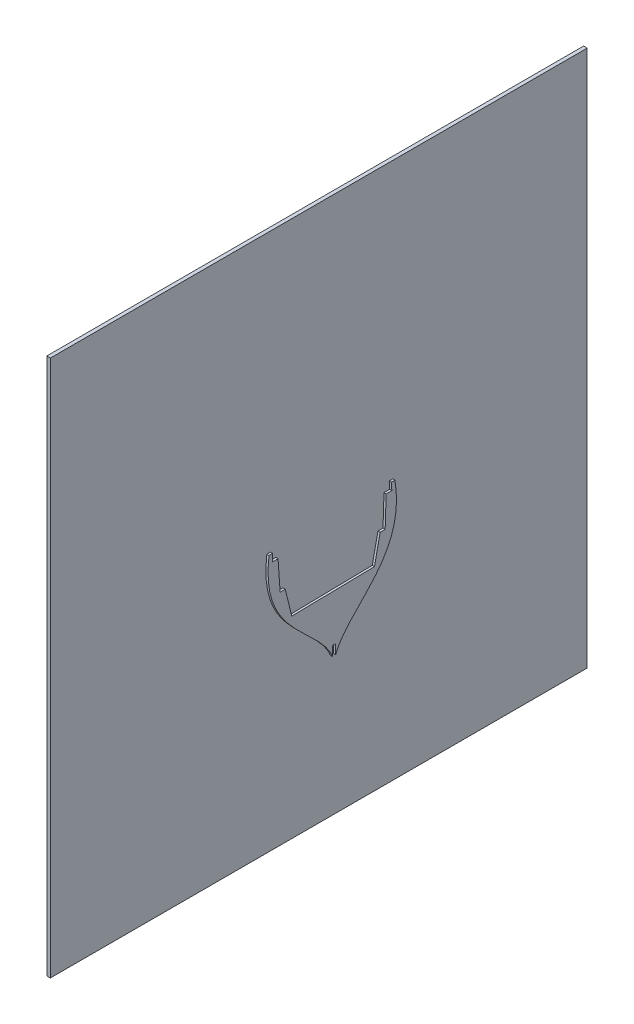
ISO-10303-21;
HEADER;
FILE_DESCRIPTION(('STEP AP214'),'2;1');
FILE_NAME('part.step','',(''),(''),'','','');
FILE_SCHEMA(('AUTOMOTIVE_DESIGN { 1 0 10303 214 1 1 1 1 }'));
ENDSEC;
DATA;
#1=APPLICATION_CONTEXT('core data for automotive mechanical design processes');
#2=APPLICATION_PROTOCOL_DEFINITION('international standard','automotive_design',2000,#1);
#3=PRODUCT_CONTEXT('',#1,'mechanical');
#4=PRODUCT('Part','Part','',(#3));
#5=PRODUCT_RELATED_PRODUCT_CATEGORY('part','',(#4));
#6=PRODUCT_DEFINITION_FORMATION('','',#4);
#7=PRODUCT_DEFINITION_CONTEXT('part definition',#1,'design');
#8=PRODUCT_DEFINITION('design','',#6,#7);
#9=PRODUCT_DEFINITION_SHAPE('','',#8);
#10=(LENGTH_UNIT() NAMED_UNIT(*) SI_UNIT(.MILLI.,.METRE.));
#11=(NAMED_UNIT(*) PLANE_ANGLE_UNIT() SI_UNIT($,.RADIAN.));
#12=(NAMED_UNIT(*) SI_UNIT($,.STERADIAN.) SOLID_ANGLE_UNIT());
#13=UNCERTAINTY_MEASURE_WITH_UNIT(LENGTH_MEASURE(1.E-05),#10,'distance_accuracy_value','');
#14=(GEOMETRIC_REPRESENTATION_CONTEXT(3) GLOBAL_UNCERTAINTY_ASSIGNED_CONTEXT((#13)) GLOBAL_UNIT_ASSIGNED_CONTEXT((#10,
#11,#12)) REPRESENTATION_CONTEXT('',''));
#15=CARTESIAN_POINT('',(0.,0.,0.));
#16=DIRECTION('',(0.,0.,1.));
#17=DIRECTION('',(1.,0.,0.));
#18=AXIS2_PLACEMENT_3D('',#15,#16,#17);
#19=CARTESIAN_POINT('',(6.,354.14290279738,182.445244332377));
#20=CARTESIAN_POINT('',(6.,127.075372846302,211.353019638818));
#21=CARTESIAN_POINT('',(6.,119.589146316814,16.394807678994));
#22=CARTESIAN_POINT('',(6.,15.6805323322991,0.284058758771133));
#23=CARTESIAN_POINT('',(6.,0.,0.));
#24=B_SPLINE_CURVE_WITH_KNOTS('',4,(#19,#20,#21,#22,#23),.UNSPECIFIED.,.F.,.F.,(5,5),(0.,1.),.UNSPECIFIED.);
#25=DIRECTION('',(-1.,0.,0.));
#26=VECTOR('',#25,1.);
#27=SURFACE_OF_LINEAR_EXTRUSION('',#24,#26);
#28=CARTESIAN_POINT('',(0.,354.14290279738,182.445244332377));
#29=CARTESIAN_POINT('',(0.,127.075372846302,211.353019638818));
#30=CARTESIAN_POINT('',(0.,119.589146316814,16.394807678994));
#31=CARTESIAN_POINT('',(0.,15.6805323322991,0.284058758771133));
#32=CARTESIAN_POINT('',(0.,0.,0.));
#33=B_SPLINE_CURVE_WITH_KNOTS('',4,(#28,#29,#30,#31,#32),.UNSPECIFIED.,.F.,.F.,(5,5),(0.,1.),.UNSPECIFIED.);
#34=CARTESIAN_POINT('',(0.,354.14290279738,182.445244332377));
#35=VERTEX_POINT('',#34);
#36=CARTESIAN_POINT('',(0.,20.8021304929707,4.87831519262331));
#37=VERTEX_POINT('',#36);
#38=EDGE_CURVE('E191',#35,#37,#33,.T.);
#39=ORIENTED_EDGE('',*,*,#38,.T.);
#40=DIRECTION('',(1.,0.,0.));
#41=VECTOR('',#40,1.);
#42=CARTESIAN_POINT('',(0.,20.8021304929707,4.87831519262331));
#43=LINE('',#42,#41);
#44=CARTESIAN_POINT('',(6.,20.8021304929707,4.87831519262331));
#45=VERTEX_POINT('',#44);
#46=EDGE_CURVE('E197',#37,#45,#43,.T.);
#47=ORIENTED_EDGE('',*,*,#46,.T.);
#48=CARTESIAN_POINT('',(6.,354.14290279738,182.445244332377));
#49=VERTEX_POINT('',#48);
#50=EDGE_CURVE('E231',#49,#45,#24,.T.);
#51=ORIENTED_EDGE('',*,*,#50,.F.);
#52=DIRECTION('',(-1.,0.,0.));
#53=VECTOR('',#52,1.);
#54=CARTESIAN_POINT('',(6.,354.14290279738,182.445244332377));
#55=LINE('',#54,#53);
#56=EDGE_CURVE('E187',#49,#35,#55,.T.);
#57=ORIENTED_EDGE('',*,*,#56,.T.);
#58=EDGE_LOOP('',(#39,#47,#51,#57));
#59=FACE_BOUND('',#58,.T.);
#60=ADVANCED_FACE('F45',(#59),#27,.F.);
#61=CARTESIAN_POINT('',(6.,0.,0.));
#62=CARTESIAN_POINT('',(6.,15.6805323322991,0.284058758771133));
#63=CARTESIAN_POINT('',(6.,120.104483055444,-12.0526671571066));
#64=CARTESIAN_POINT('',(6.,134.646963610102,-206.611820777644));
#65=CARTESIAN_POINT('',(6.,360.518503443272,-169.498883348176));
#66=B_SPLINE_CURVE_WITH_KNOTS('',4,(#61,#62,#63,#64,#65),.UNSPECIFIED.,.F.,.F.,(5,5),(0.,1.),.UNSPECIFIED.);
#67=DIRECTION('',(-1.,0.,0.));
#68=VECTOR('',#67,1.);
#69=SURFACE_OF_LINEAR_EXTRUSION('',#66,#68);
#70=CARTESIAN_POINT('',(6.,20.9651688882728,-4.12168480737669));
#71=VERTEX_POINT('',#70);
#72=CARTESIAN_POINT('',(6.,360.518503443272,-169.498883348176));
#73=VERTEX_POINT('',#72);
#74=EDGE_CURVE('E128',#71,#73,#66,.T.);
#75=ORIENTED_EDGE('',*,*,#74,.F.);
#76=DIRECTION('',(1.,0.,0.));
#77=VECTOR('',#76,1.);
#78=CARTESIAN_POINT('',(0.,20.9651688882728,-4.12168480737669));
#79=LINE('',#78,#77);
#80=CARTESIAN_POINT('',(0.,20.9651688882728,-4.12168480737669));
#81=VERTEX_POINT('',#80);
#82=EDGE_CURVE('E323',#81,#71,#79,.T.);
#83=ORIENTED_EDGE('',*,*,#82,.F.);
#84=CARTESIAN_POINT('',(0.,0.,0.));
#85=CARTESIAN_POINT('',(0.,15.6805323322991,0.284058758771133));
#86=CARTESIAN_POINT('',(0.,120.104483055444,-12.0526671571066));
#87=CARTESIAN_POINT('',(0.,134.646963610102,-206.611820777644));
#88=CARTESIAN_POINT('',(0.,360.518503443272,-169.498883348176));
#89=B_SPLINE_CURVE_WITH_KNOTS('',4,(#84,#85,#86,#87,#88),.UNSPECIFIED.,.F.,.F.,(5,5),(0.,1.),.UNSPECIFIED.);
#90=CARTESIAN_POINT('',(0.,360.518503443272,-169.498883348176));
#91=VERTEX_POINT('',#90);
#92=EDGE_CURVE('E196',#81,#91,#89,.T.);
#93=ORIENTED_EDGE('',*,*,#92,.T.);
#94=DIRECTION('',(-1.,0.,0.));
#95=VECTOR('',#94,1.);
#96=CARTESIAN_POINT('',(6.,360.518503443272,-169.498883348176));
#97=LINE('',#96,#95);
#98=EDGE_CURVE('E13',#73,#91,#97,.T.);
#99=ORIENTED_EDGE('',*,*,#98,.F.);
#100=EDGE_LOOP('',(#75,#83,#93,#99));
#101=FACE_BOUND('',#100,.T.);
#102=ADVANCED_FACE('F335',(#101),#69,.F.);
#103=CARTESIAN_POINT('',(6.,360.518503443272,-169.498883348176));
#104=DIRECTION('',(0.,-0.999835956927465,-0.0181124055536444));
#105=DIRECTION('',(0.,0.0181124055536444,-0.999835956927465));
#106=AXIS2_PLACEMENT_3D('',#103,#104,#105);
#107=PLANE('',#106);
#108=DIRECTION('',(0.,-0.0181124055536444,0.999835956927465));
#109=VECTOR('',#108,1.);
#110=CARTESIAN_POINT('',(0.,360.518503443272,-169.498883348176));
#111=LINE('',#110,#109);
#112=CARTESIAN_POINT('',(0.,360.337349670715,-159.498883348176));
#113=VERTEX_POINT('',#112);
#114=EDGE_CURVE('E204',#91,#113,#111,.T.);
#115=ORIENTED_EDGE('',*,*,#114,.T.);
#116=DIRECTION('',(-1.,0.,0.));
#117=VECTOR('',#116,1.);
#118=CARTESIAN_POINT('',(6.,360.337349670715,-159.498883348176));
#119=LINE('',#118,#117);
#120=CARTESIAN_POINT('',(6.,360.337349670715,-159.498883348176));
#121=VERTEX_POINT('',#120);
#122=EDGE_CURVE('E53',#121,#113,#119,.T.);
#123=ORIENTED_EDGE('',*,*,#122,.F.);
#124=DIRECTION('',(0.,-0.0181124055536444,0.999835956927465));
#125=VECTOR('',#124,1.);
#126=CARTESIAN_POINT('',(6.,360.518503443272,-169.498883348176));
#127=LINE('',#126,#125);
#128=EDGE_CURVE('E317',#73,#121,#127,.T.);
#129=ORIENTED_EDGE('',*,*,#128,.F.);
#130=ORIENTED_EDGE('',*,*,#98,.T.);
#131=EDGE_LOOP('',(#115,#123,#129,#130));
#132=FACE_BOUND('',#131,.T.);
#133=ADVANCED_FACE('F338',(#132),#107,.F.);
#134=CARTESIAN_POINT('',(6.,360.337349670715,-159.498883348176));
#135=DIRECTION('',(0.,0.0615422827320697,-0.998104477214748));
#136=DIRECTION('',(0.,0.998104477214748,0.0615422827320697));
#137=AXIS2_PLACEMENT_3D('',#134,#135,#136);
#138=PLANE('',#137);
#139=DIRECTION('',(0.,-0.998104477214748,-0.0615422827320697));
#140=VECTOR('',#139,1.);
#141=CARTESIAN_POINT('',(0.,360.337349670715,-159.498883348176));
#142=LINE('',#141,#140);
#143=CARTESIAN_POINT('',(0.,339.756849084553,-160.76785970762));
#144=VERTEX_POINT('',#143);
#145=EDGE_CURVE('E209',#113,#144,#142,.T.);
#146=ORIENTED_EDGE('',*,*,#145,.T.);
#147=DIRECTION('',(-1.,0.,0.));
#148=VECTOR('',#147,1.);
#149=CARTESIAN_POINT('',(6.,339.756849084553,-160.76785970762));
#150=LINE('',#149,#148);
#151=CARTESIAN_POINT('',(6.,339.756849084553,-160.76785970762));
#152=VERTEX_POINT('',#151);
#153=EDGE_CURVE('E256',#152,#144,#150,.T.);
#154=ORIENTED_EDGE('',*,*,#153,.F.);
#155=DIRECTION('',(0.,-0.998104477214748,-0.0615422827320697));
#156=VECTOR('',#155,1.);
#157=CARTESIAN_POINT('',(6.,360.337349670715,-159.498883348176));
#158=LINE('',#157,#156);
#159=EDGE_CURVE('E265',#121,#152,#158,.T.);
#160=ORIENTED_EDGE('',*,*,#159,.F.);
#161=ORIENTED_EDGE('',*,*,#122,.T.);
#162=EDGE_LOOP('',(#146,#154,#160,#161));
#163=FACE_BOUND('',#162,.T.);
#164=ADVANCED_FACE('F263',(#163),#138,.F.);
#165=CARTESIAN_POINT('',(6.,339.756849084553,-160.76785970762));
#166=DIRECTION('',(0.,-0.999835956927465,-0.0181124055536401));
#167=DIRECTION('',(0.,0.0181124055536401,-0.999835956927466));
#168=AXIS2_PLACEMENT_3D('',#165,#166,#167);
#169=PLANE('',#168);
#170=DIRECTION('',(0.,-0.0181124055536401,0.999835956927465));
#171=VECTOR('',#170,1.);
#172=CARTESIAN_POINT('',(0.,339.756849084553,-160.76785970762));
#173=LINE('',#172,#171);
#174=CARTESIAN_POINT('',(0.,339.469822373553,-144.923491304635));
#175=VERTEX_POINT('',#174);
#176=EDGE_CURVE('E211',#144,#175,#173,.T.);
#177=ORIENTED_EDGE('',*,*,#176,.T.);
#178=DIRECTION('',(-1.,0.,0.));
#179=VECTOR('',#178,1.);
#180=CARTESIAN_POINT('',(6.,339.469822373553,-144.923491304635));
#181=LINE('',#180,#179);
#182=CARTESIAN_POINT('',(6.,339.469822373553,-144.923491304635));
#183=VERTEX_POINT('',#182);
#184=EDGE_CURVE('E253',#183,#175,#181,.T.);
#185=ORIENTED_EDGE('',*,*,#184,.F.);
#186=DIRECTION('',(0.,-0.0181124055536401,0.999835956927465));
#187=VECTOR('',#186,1.);
#188=CARTESIAN_POINT('',(6.,339.756849084553,-160.76785970762));
#189=LINE('',#188,#187);
#190=EDGE_CURVE('E287',#152,#183,#189,.T.);
#191=ORIENTED_EDGE('',*,*,#190,.F.);
#192=ORIENTED_EDGE('',*,*,#153,.T.);
#193=EDGE_LOOP('',(#177,#185,#191,#192));
#194=FACE_BOUND('',#193,.T.);
#195=ADVANCED_FACE('F278',(#194),#169,.F.);
#196=CARTESIAN_POINT('',(6.,339.469822373553,-144.923491304635));
#197=DIRECTION('',(0.,-0.0328630670926228,-0.999459863536934));
#198=DIRECTION('',(0.,0.999459863536934,-0.0328630670926228));
#199=AXIS2_PLACEMENT_3D('',#196,#197,#198);
#200=PLANE('',#199);
#201=DIRECTION('',(0.,-0.999459863536934,0.0328630670926228));
#202=VECTOR('',#201,1.);
#203=CARTESIAN_POINT('',(0.,339.469822373553,-144.923491304635));
#204=LINE('',#203,#202);
#205=CARTESIAN_POINT('',(0.,255.19639745031,-142.152511379961));
#206=VERTEX_POINT('',#205);
#207=EDGE_CURVE('E213',#175,#206,#204,.T.);
#208=ORIENTED_EDGE('',*,*,#207,.T.);
#209=DIRECTION('',(-1.,0.,0.));
#210=VECTOR('',#209,1.);
#211=CARTESIAN_POINT('',(6.,255.19639745031,-142.152511379961));
#212=LINE('',#211,#210);
#213=CARTESIAN_POINT('',(6.,255.19639745031,-142.152511379961));
#214=VERTEX_POINT('',#213);
#215=EDGE_CURVE('E250',#214,#206,#212,.T.);
#216=ORIENTED_EDGE('',*,*,#215,.F.);
#217=DIRECTION('',(0.,-0.999459863536934,0.0328630670926228));
#218=VECTOR('',#217,1.);
#219=CARTESIAN_POINT('',(6.,339.469822373553,-144.923491304635));
#220=LINE('',#219,#218);
#221=EDGE_CURVE('E284',#183,#214,#220,.T.);
#222=ORIENTED_EDGE('',*,*,#221,.F.);
#223=ORIENTED_EDGE('',*,*,#184,.T.);
#224=EDGE_LOOP('',(#208,#216,#222,#223));
#225=FACE_BOUND('',#224,.T.);
#226=ADVANCED_FACE('F282',(#225),#200,.F.);
#227=CARTESIAN_POINT('',(6.,255.19639745031,-142.152511379961));
#228=DIRECTION('',(0.,-0.999835956927465,-0.0181124055536419));
#229=DIRECTION('',(0.,0.0181124055536419,-0.999835956927466));
#230=AXIS2_PLACEMENT_3D('',#227,#228,#229);
#231=PLANE('',#230);
#232=DIRECTION('',(0.,-0.0181124055536419,0.999835956927466));
#233=VECTOR('',#232,1.);
#234=CARTESIAN_POINT('',(0.,255.19639745031,-142.152511379961));
#235=LINE('',#234,#233);
#236=CARTESIAN_POINT('',(0.,254.939924048743,-127.994738238122));
#237=VERTEX_POINT('',#236);
#238=EDGE_CURVE('E215',#206,#237,#235,.T.);
#239=ORIENTED_EDGE('',*,*,#238,.T.);
#240=DIRECTION('',(-1.,0.,0.));
#241=VECTOR('',#240,1.);
#242=CARTESIAN_POINT('',(6.,254.939924048743,-127.994738238122));
#243=LINE('',#242,#241);
#244=CARTESIAN_POINT('',(6.,254.939924048743,-127.994738238122));
#245=VERTEX_POINT('',#244);
#246=EDGE_CURVE('E247',#245,#237,#243,.T.);
#247=ORIENTED_EDGE('',*,*,#246,.F.);
#248=DIRECTION('',(0.,-0.0181124055536419,0.999835956927466));
#249=VECTOR('',#248,1.);
#250=CARTESIAN_POINT('',(6.,255.19639745031,-142.152511379961));
#251=LINE('',#250,#249);
#252=EDGE_CURVE('E286',#214,#245,#251,.T.);
#253=ORIENTED_EDGE('',*,*,#252,.F.);
#254=ORIENTED_EDGE('',*,*,#215,.T.);
#255=EDGE_LOOP('',(#239,#247,#253,#254));
#256=FACE_BOUND('',#255,.T.);
#257=ADVANCED_FACE('F348',(#256),#231,.F.);
#258=CARTESIAN_POINT('',(6.,254.939924048743,-127.994738238122));
#259=DIRECTION('',(0.,-0.204713614072454,-0.978821912409706));
#260=DIRECTION('',(0.,0.978821912409706,-0.204713614072454));
#261=AXIS2_PLACEMENT_3D('',#258,#259,#260);
#262=PLANE('',#261);
#263=DIRECTION('',(0.,-0.978821912409706,0.204713614072454));
#264=VECTOR('',#263,1.);
#265=CARTESIAN_POINT('',(0.,254.939924048743,-127.994738238122));
#266=LINE('',#265,#264);
#267=CARTESIAN_POINT('',(0.,179.89257139475,-112.299120277806));
#268=VERTEX_POINT('',#267);
#269=EDGE_CURVE('E217',#237,#268,#266,.T.);
#270=ORIENTED_EDGE('',*,*,#269,.T.);
#271=DIRECTION('',(-1.,0.,0.));
#272=VECTOR('',#271,1.);
#273=CARTESIAN_POINT('',(6.,179.89257139475,-112.299120277806));
#274=LINE('',#273,#272);
#275=CARTESIAN_POINT('',(6.,179.89257139475,-112.299120277806));
#276=VERTEX_POINT('',#275);
#277=EDGE_CURVE('E244',#276,#268,#274,.T.);
#278=ORIENTED_EDGE('',*,*,#277,.F.);
#279=DIRECTION('',(0.,-0.978821912409706,0.204713614072454));
#280=VECTOR('',#279,1.);
#281=CARTESIAN_POINT('',(6.,254.939924048743,-127.994738238122));
#282=LINE('',#281,#280);
#283=EDGE_CURVE('E289',#245,#276,#282,.T.);
#284=ORIENTED_EDGE('',*,*,#283,.F.);
#285=ORIENTED_EDGE('',*,*,#246,.T.);
#286=EDGE_LOOP('',(#270,#278,#284,#285));
#287=FACE_BOUND('',#286,.T.);
#288=ADVANCED_FACE('F351',(#287),#262,.F.);
#289=CARTESIAN_POINT('',(6.,179.89257139475,-112.299120277806));
#290=DIRECTION('',(0.,-0.999835956927465,-0.0181124055536431));
#291=DIRECTION('',(0.,0.0181124055536431,-0.999835956927466));
#292=AXIS2_PLACEMENT_3D('',#289,#290,#291);
#293=PLANE('',#292);
#294=DIRECTION('',(0.,-0.0181124055536431,0.999835956927465));
#295=VECTOR('',#294,1.);
#296=CARTESIAN_POINT('',(0.,179.89257139475,-112.299120277806));
#297=LINE('',#296,#295);
#298=CARTESIAN_POINT('',(0.,175.707193466071,118.740944170329));
#299=VERTEX_POINT('',#298);
#300=EDGE_CURVE('E219',#268,#299,#297,.T.);
#301=ORIENTED_EDGE('',*,*,#300,.T.);
#302=DIRECTION('',(-1.,0.,0.));
#303=VECTOR('',#302,1.);
#304=CARTESIAN_POINT('',(6.,175.707193466071,118.740944170329));
#305=LINE('',#304,#303);
#306=CARTESIAN_POINT('',(6.,175.707193466071,118.740944170329));
#307=VERTEX_POINT('',#306);
#308=EDGE_CURVE('E241',#307,#299,#305,.T.);
#309=ORIENTED_EDGE('',*,*,#308,.F.);
#310=DIRECTION('',(0.,-0.0181124055536431,0.999835956927465));
#311=VECTOR('',#310,1.);
#312=CARTESIAN_POINT('',(6.,179.89257139475,-112.299120277806));
#313=LINE('',#312,#311);
#314=EDGE_CURVE('E295',#276,#307,#313,.T.);
#315=ORIENTED_EDGE('',*,*,#314,.F.);
#316=ORIENTED_EDGE('',*,*,#277,.T.);
#317=EDGE_LOOP('',(#301,#309,#315,#316));
#318=FACE_BOUND('',#317,.T.);
#319=ADVANCED_FACE('F355',(#318),#293,.F.);
#320=CARTESIAN_POINT('',(6.,250.136828640148,137.14439415621));
#321=DIRECTION('',(0.,-0.240031119993913,0.970765193769568));
#322=DIRECTION('',(0.,-0.970765193769568,-0.240031119993913));
#323=AXIS2_PLACEMENT_3D('',#320,#321,#322);
#324=PLANE('',#323);
#325=DIRECTION('',(0.,0.970765193769568,0.240031119993913));
#326=VECTOR('',#325,1.);
#327=CARTESIAN_POINT('',(0.,250.136828640148,137.14439415621));
#328=LINE('',#327,#326);
#329=CARTESIAN_POINT('',(0.,250.136828640148,137.14439415621));
#330=VERTEX_POINT('',#329);
#331=EDGE_CURVE('E221',#299,#330,#328,.T.);
#332=ORIENTED_EDGE('',*,*,#331,.T.);
#333=DIRECTION('',(-1.,0.,0.));
#334=VECTOR('',#333,1.);
#335=CARTESIAN_POINT('',(6.,250.136828640148,137.14439415621));
#336=LINE('',#335,#334);
#337=CARTESIAN_POINT('',(6.,250.136828640148,137.14439415621));
#338=VERTEX_POINT('',#337);
#339=EDGE_CURVE('E238',#338,#330,#336,.T.);
#340=ORIENTED_EDGE('',*,*,#339,.F.);
#341=DIRECTION('',(0.,0.970765193769568,0.240031119993913));
#342=VECTOR('',#341,1.);
#343=CARTESIAN_POINT('',(6.,250.136828640148,137.14439415621));
#344=LINE('',#343,#342);
#345=EDGE_CURVE('E297',#307,#338,#344,.T.);
#346=ORIENTED_EDGE('',*,*,#345,.F.);
#347=ORIENTED_EDGE('',*,*,#308,.T.);
#348=EDGE_LOOP('',(#332,#340,#346,#347));
#349=FACE_BOUND('',#348,.T.);
#350=ADVANCED_FACE('F359',(#349),#324,.F.);
#351=CARTESIAN_POINT('',(6.,249.880355238581,151.302167298049));
#352=DIRECTION('',(0.,-0.999835956927465,-0.0181124055536438));
#353=DIRECTION('',(0.,0.0181124055536438,-0.999835956927466));
#354=AXIS2_PLACEMENT_3D('',#351,#352,#353);
#355=PLANE('',#354);
#356=DIRECTION('',(0.,-0.0181124055536438,0.999835956927465));
#357=VECTOR('',#356,1.);
#358=CARTESIAN_POINT('',(0.,249.880355238581,151.302167298049));
#359=LINE('',#358,#357);
#360=CARTESIAN_POINT('',(0.,249.880355238581,151.302167298049));
#361=VERTEX_POINT('',#360);
#362=EDGE_CURVE('E223',#330,#361,#359,.T.);
#363=ORIENTED_EDGE('',*,*,#362,.T.);
#364=DIRECTION('',(-1.,0.,0.));
#365=VECTOR('',#364,1.);
#366=CARTESIAN_POINT('',(6.,249.880355238581,151.302167298049));
#367=LINE('',#366,#365);
#368=CARTESIAN_POINT('',(6.,249.880355238581,151.302167298049));
#369=VERTEX_POINT('',#368);
#370=EDGE_CURVE('E235',#369,#361,#367,.T.);
#371=ORIENTED_EDGE('',*,*,#370,.F.);
#372=DIRECTION('',(0.,-0.0181124055536438,0.999835956927465));
#373=VECTOR('',#372,1.);
#374=CARTESIAN_POINT('',(6.,249.880355238581,151.302167298049));
#375=LINE('',#374,#373);
#376=EDGE_CURVE('E299',#338,#369,#375,.T.);
#377=ORIENTED_EDGE('',*,*,#376,.F.);
#378=ORIENTED_EDGE('',*,*,#339,.T.);
#379=EDGE_LOOP('',(#363,#371,#377,#378));
#380=FACE_BOUND('',#379,.T.);
#381=ADVANCED_FACE('F305',(#380),#355,.F.);
#382=CARTESIAN_POINT('',(6.,333.998125053212,157.123617241952));
#383=DIRECTION('',(0.,-0.0690408105736718,0.997613836349181));
#384=DIRECTION('',(0.,-0.997613836349181,-0.0690408105736718));
#385=AXIS2_PLACEMENT_3D('',#382,#383,#384);
#386=PLANE('',#385);
#387=DIRECTION('',(0.,0.997613836349181,0.0690408105736718));
#388=VECTOR('',#387,1.);
#389=CARTESIAN_POINT('',(0.,333.998125053212,157.123617241952));
#390=LINE('',#389,#388);
#391=CARTESIAN_POINT('',(0.,333.998125053212,157.123617241952));
#392=VERTEX_POINT('',#391);
#393=EDGE_CURVE('E225',#361,#392,#390,.T.);
#394=ORIENTED_EDGE('',*,*,#393,.T.);
#395=DIRECTION('',(-1.,0.,0.));
#396=VECTOR('',#395,1.);
#397=CARTESIAN_POINT('',(6.,333.998125053212,157.123617241952));
#398=LINE('',#397,#396);
#399=CARTESIAN_POINT('',(6.,333.998125053212,157.123617241952));
#400=VERTEX_POINT('',#399);
#401=EDGE_CURVE('E182',#400,#392,#398,.T.);
#402=ORIENTED_EDGE('',*,*,#401,.F.);
#403=DIRECTION('',(0.,0.997613836349181,0.0690408105736718));
#404=VECTOR('',#403,1.);
#405=CARTESIAN_POINT('',(6.,333.998125053212,157.123617241952));
#406=LINE('',#405,#404);
#407=EDGE_CURVE('E170',#369,#400,#406,.T.);
#408=ORIENTED_EDGE('',*,*,#407,.F.);
#409=ORIENTED_EDGE('',*,*,#370,.T.);
#410=EDGE_LOOP('',(#394,#402,#408,#409));
#411=FACE_BOUND('',#410,.T.);
#412=ADVANCED_FACE('F309',(#411),#386,.F.);
#413=CARTESIAN_POINT('',(6.,333.711098342212,172.967985644937));
#414=DIRECTION('',(0.,-0.999835956927465,-0.0181124055536435));
#415=DIRECTION('',(0.,0.0181124055536435,-0.999835956927465));
#416=AXIS2_PLACEMENT_3D('',#413,#414,#415);
#417=PLANE('',#416);
#418=DIRECTION('',(0.,-0.0181124055536435,0.999835956927466));
#419=VECTOR('',#418,1.);
#420=CARTESIAN_POINT('',(0.,333.711098342212,172.967985644937));
#421=LINE('',#420,#419);
#422=CARTESIAN_POINT('',(0.,333.711098342212,172.967985644937));
#423=VERTEX_POINT('',#422);
#424=EDGE_CURVE('E179',#392,#423,#421,.T.);
#425=ORIENTED_EDGE('',*,*,#424,.T.);
#426=DIRECTION('',(-1.,0.,0.));
#427=VECTOR('',#426,1.);
#428=CARTESIAN_POINT('',(6.,333.711098342212,172.967985644937));
#429=LINE('',#428,#427);
#430=CARTESIAN_POINT('',(6.,333.711098342212,172.967985644937));
#431=VERTEX_POINT('',#430);
#432=EDGE_CURVE('E176',#431,#423,#429,.T.);
#433=ORIENTED_EDGE('',*,*,#432,.F.);
#434=DIRECTION('',(0.,-0.0181124055536435,0.999835956927466));
#435=VECTOR('',#434,1.);
#436=CARTESIAN_POINT('',(6.,333.711098342212,172.967985644937));
#437=LINE('',#436,#435);
#438=EDGE_CURVE('E163',#400,#431,#437,.T.);
#439=ORIENTED_EDGE('',*,*,#438,.F.);
#440=ORIENTED_EDGE('',*,*,#401,.T.);
#441=EDGE_LOOP('',(#425,#433,#439,#440));
#442=FACE_BOUND('',#441,.T.);
#443=ADVANCED_FACE('F177',(#442),#417,.F.);
#444=CARTESIAN_POINT('',(6.,354.324056569938,172.445244332377));
#445=DIRECTION('',(0.,0.0253516887165575,0.999678594288794));
#446=DIRECTION('',(0.,-0.999678594288794,0.0253516887165575));
#447=AXIS2_PLACEMENT_3D('',#444,#445,#446);
#448=PLANE('',#447);
#449=DIRECTION('',(0.,0.999678594288794,-0.0253516887165575));
#450=VECTOR('',#449,1.);
#451=CARTESIAN_POINT('',(0.,354.324056569938,172.445244332377));
#452=LINE('',#451,#450);
#453=CARTESIAN_POINT('',(0.,354.324056569938,172.445244332377));
#454=VERTEX_POINT('',#453);
#455=EDGE_CURVE('E228',#423,#454,#452,.T.);
#456=ORIENTED_EDGE('',*,*,#455,.T.);
#457=DIRECTION('',(-1.,0.,0.));
#458=VECTOR('',#457,1.);
#459=CARTESIAN_POINT('',(6.,354.324056569938,172.445244332377));
#460=LINE('',#459,#458);
#461=CARTESIAN_POINT('',(6.,354.324056569938,172.445244332377));
#462=VERTEX_POINT('',#461);
#463=EDGE_CURVE('E183',#462,#454,#460,.T.);
#464=ORIENTED_EDGE('',*,*,#463,.F.);
#465=DIRECTION('',(0.,0.999678594288794,-0.0253516887165575));
#466=VECTOR('',#465,1.);
#467=CARTESIAN_POINT('',(6.,354.324056569938,172.445244332377));
#468=LINE('',#467,#466);
#469=EDGE_CURVE('E167',#431,#462,#468,.T.);
#470=ORIENTED_EDGE('',*,*,#469,.F.);
#471=ORIENTED_EDGE('',*,*,#432,.T.);
#472=EDGE_LOOP('',(#456,#464,#470,#471));
#473=FACE_BOUND('',#472,.T.);
#474=ADVANCED_FACE('F185',(#473),#448,.F.);
#475=CARTESIAN_POINT('',(6.,354.14290279738,182.445244332377));
#476=DIRECTION('',(0.,-0.999835956927465,-0.0181124055536444));
#477=DIRECTION('',(0.,0.0181124055536444,-0.999835956927465));
#478=AXIS2_PLACEMENT_3D('',#475,#476,#477);
#479=PLANE('',#478);
#480=DIRECTION('',(0.,-0.0181124055536444,0.999835956927465));
#481=VECTOR('',#480,1.);
#482=CARTESIAN_POINT('',(0.,354.14290279738,182.445244332377));
#483=LINE('',#482,#481);
#484=EDGE_CURVE('E120',#454,#35,#483,.T.);
#485=ORIENTED_EDGE('',*,*,#484,.T.);
#486=ORIENTED_EDGE('',*,*,#56,.F.);
#487=DIRECTION('',(0.,-0.0181124055536444,0.999835956927465));
#488=VECTOR('',#487,1.);
#489=CARTESIAN_POINT('',(6.,354.14290279738,182.445244332377));
#490=LINE('',#489,#488);
#491=EDGE_CURVE('E69',#462,#49,#490,.T.);
#492=ORIENTED_EDGE('',*,*,#491,.F.);
#493=ORIENTED_EDGE('',*,*,#463,.T.);
#494=EDGE_LOOP('',(#485,#486,#492,#493));
#495=FACE_BOUND('',#494,.T.);
#496=ADVANCED_FACE('F311',(#495),#479,.F.);
#497=CARTESIAN_POINT('',(6.,102.668837588292,70.4601502497936));
#498=DIRECTION('',(-1.,0.,0.));
#499=DIRECTION('',(0.,0.,1.));
#500=AXIS2_PLACEMENT_3D('',#497,#498,#499);
#501=PLANE('',#500);
#502=ORIENTED_EDGE('',*,*,#50,.T.);
#503=DIRECTION('',(0.,-0.999835956927465,-0.0181124055536429));
#504=VECTOR('',#503,1.);
#505=CARTESIAN_POINT('',(6.,20.8021304929707,4.87831519262331));
#506=LINE('',#505,#504);
#507=CARTESIAN_POINT('',(6.,47.8021304929707,5.36743037852959));
#508=VERTEX_POINT('',#507);
#509=EDGE_CURVE('E511',#508,#45,#506,.T.);
#510=ORIENTED_EDGE('',*,*,#509,.F.);
#511=DIRECTION('',(0.,-0.0181124055536438,0.999835956927465));
#512=VECTOR('',#511,1.);
#513=CARTESIAN_POINT('',(6.,47.8021304929707,5.36743037852959));
#514=LINE('',#513,#512);
#515=CARTESIAN_POINT('',(6.,47.9651688882728,-3.63256962147041));
#516=VERTEX_POINT('',#515);
#517=EDGE_CURVE('E519',#516,#508,#514,.T.);
#518=ORIENTED_EDGE('',*,*,#517,.F.);
#519=DIRECTION('',(0.,0.999835956927465,0.0181124055536428));
#520=VECTOR('',#519,1.);
#521=CARTESIAN_POINT('',(6.,47.9651688882728,-3.63256962147041));
#522=LINE('',#521,#520);
#523=EDGE_CURVE('E523',#71,#516,#522,.T.);
#524=ORIENTED_EDGE('',*,*,#523,.F.);
#525=ORIENTED_EDGE('',*,*,#74,.T.);
#526=ORIENTED_EDGE('',*,*,#128,.T.);
#527=ORIENTED_EDGE('',*,*,#159,.T.);
#528=ORIENTED_EDGE('',*,*,#190,.T.);
#529=ORIENTED_EDGE('',*,*,#221,.T.);
#530=ORIENTED_EDGE('',*,*,#252,.T.);
#531=ORIENTED_EDGE('',*,*,#283,.T.);
#532=ORIENTED_EDGE('',*,*,#314,.T.);
#533=ORIENTED_EDGE('',*,*,#345,.T.);
#534=ORIENTED_EDGE('',*,*,#376,.T.);
#535=ORIENTED_EDGE('',*,*,#407,.T.);
#536=ORIENTED_EDGE('',*,*,#438,.T.);
#537=ORIENTED_EDGE('',*,*,#469,.T.);
#538=ORIENTED_EDGE('',*,*,#491,.T.);
#539=EDGE_LOOP('',(#502,#510,#518,#524,#525,#526,#527,#528,#529,#530,#531,#532,#533,#534,#535,
#536,#537,#538));
#540=FACE_BOUND('',#539,.T.);
#541=ADVANCED_FACE('F165',(#540),#501,.F.);
#542=CARTESIAN_POINT('',(0.,102.668837588292,70.4601502497936));
#543=DIRECTION('',(-1.,0.,0.));
#544=DIRECTION('',(0.,0.,1.));
#545=AXIS2_PLACEMENT_3D('',#542,#543,#544);
#546=PLANE('',#545);
#547=DIRECTION('',(0.,-0.999835956927465,-0.0181124055536429));
#548=VECTOR('',#547,1.);
#549=CARTESIAN_POINT('',(0.,20.8021304929707,4.87831519262331));
#550=LINE('',#549,#548);
#551=CARTESIAN_POINT('',(0.,47.8021304929707,5.36743037852959));
#552=VERTEX_POINT('',#551);
#553=EDGE_CURVE('E532',#552,#37,#550,.T.);
#554=ORIENTED_EDGE('',*,*,#553,.T.);
#555=ORIENTED_EDGE('',*,*,#38,.F.);
#556=ORIENTED_EDGE('',*,*,#484,.F.);
#557=ORIENTED_EDGE('',*,*,#455,.F.);
#558=ORIENTED_EDGE('',*,*,#424,.F.);
#559=ORIENTED_EDGE('',*,*,#393,.F.);
#560=ORIENTED_EDGE('',*,*,#362,.F.);
#561=ORIENTED_EDGE('',*,*,#331,.F.);
#562=ORIENTED_EDGE('',*,*,#300,.F.);
#563=ORIENTED_EDGE('',*,*,#269,.F.);
#564=ORIENTED_EDGE('',*,*,#238,.F.);
#565=ORIENTED_EDGE('',*,*,#207,.F.);
#566=ORIENTED_EDGE('',*,*,#176,.F.);
#567=ORIENTED_EDGE('',*,*,#145,.F.);
#568=ORIENTED_EDGE('',*,*,#114,.F.);
#569=ORIENTED_EDGE('',*,*,#92,.F.);
#570=DIRECTION('',(0.,0.999835956927465,0.0181124055536428));
#571=VECTOR('',#570,1.);
#572=CARTESIAN_POINT('',(0.,47.9651688882728,-3.63256962147041));
#573=LINE('',#572,#571);
#574=CARTESIAN_POINT('',(0.,47.9651688882728,-3.6325696214704));
#575=VERTEX_POINT('',#574);
#576=EDGE_CURVE('E518',#81,#575,#573,.T.);
#577=ORIENTED_EDGE('',*,*,#576,.T.);
#578=DIRECTION('',(0.,-0.0181124055536438,0.999835956927465));
#579=VECTOR('',#578,1.);
#580=CARTESIAN_POINT('',(0.,47.8021304929707,5.36743037852959));
#581=LINE('',#580,#579);
#582=EDGE_CURVE('E60',#575,#552,#581,.T.);
#583=ORIENTED_EDGE('',*,*,#582,.T.);
#584=EDGE_LOOP('',(#554,#555,#556,#557,#558,#559,#560,#561,#562,#563,#564,#565,#566,#567,#568,
#569,#577,#583));
#585=FACE_BOUND('',#584,.T.);
#586=ADVANCED_FACE('F272',(#585),#546,.T.);
#587=CARTESIAN_POINT('',(0.,20.8021304929707,4.87831519262331));
#588=DIRECTION('',(0.,-0.0181124055536429,0.999835956927465));
#589=DIRECTION('',(0.,-0.999835956927466,-0.0181124055536429));
#590=AXIS2_PLACEMENT_3D('',#587,#588,#589);
#591=PLANE('',#590);
#592=ORIENTED_EDGE('',*,*,#509,.T.);
#593=ORIENTED_EDGE('',*,*,#46,.F.);
#594=ORIENTED_EDGE('',*,*,#553,.F.);
#595=DIRECTION('',(1.,0.,0.));
#596=VECTOR('',#595,1.);
#597=CARTESIAN_POINT('',(0.,47.8021304929707,5.36743037852959));
#598=LINE('',#597,#596);
#599=EDGE_CURVE('E514',#552,#508,#598,.T.);
#600=ORIENTED_EDGE('',*,*,#599,.T.);
#601=EDGE_LOOP('',(#592,#593,#594,#600));
#602=FACE_BOUND('',#601,.T.);
#603=ADVANCED_FACE('F376',(#602),#591,.F.);
#604=CARTESIAN_POINT('',(0.,47.8021304929707,5.36743037852959));
#605=DIRECTION('',(0.,0.999835956927465,0.0181124055536438));
#606=DIRECTION('',(0.,-0.0181124055536438,0.999835956927466));
#607=AXIS2_PLACEMENT_3D('',#604,#605,#606);
#608=PLANE('',#607);
#609=ORIENTED_EDGE('',*,*,#517,.T.);
#610=ORIENTED_EDGE('',*,*,#599,.F.);
#611=ORIENTED_EDGE('',*,*,#582,.F.);
#612=DIRECTION('',(1.,0.,0.));
#613=VECTOR('',#612,1.);
#614=CARTESIAN_POINT('',(0.,47.9651688882728,-3.63256962147041));
#615=LINE('',#614,#613);
#616=EDGE_CURVE('E528',#575,#516,#615,.T.);
#617=ORIENTED_EDGE('',*,*,#616,.T.);
#618=EDGE_LOOP('',(#609,#610,#611,#617));
#619=FACE_BOUND('',#618,.T.);
#620=ADVANCED_FACE('F382',(#619),#608,.F.);
#621=CARTESIAN_POINT('',(0.,47.9651688882728,-3.63256962147041));
#622=DIRECTION('',(0.,0.0181124055536428,-0.999835956927465));
#623=DIRECTION('',(0.,0.999835956927466,0.0181124055536428));
#624=AXIS2_PLACEMENT_3D('',#621,#622,#623);
#625=PLANE('',#624);
#626=ORIENTED_EDGE('',*,*,#523,.T.);
#627=ORIENTED_EDGE('',*,*,#616,.F.);
#628=ORIENTED_EDGE('',*,*,#576,.F.);
#629=ORIENTED_EDGE('',*,*,#82,.T.);
#630=EDGE_LOOP('',(#626,#627,#628,#629));
#631=FACE_BOUND('',#630,.T.);
#632=ADVANCED_FACE('F379',(#631),#625,.F.);
#633=CLOSED_SHELL('',(#60,#102,#133,#164,#195,#226,#257,#288,#319,#350,#381,#412,#443,#474,#496,
#541,#586,#603,#620,#632));
#634=MANIFOLD_SOLID_BREP('B2',#633);
#635=CARTESIAN_POINT('',(-10.,0.,0.));
#636=DIRECTION('',(-1.,0.,0.));
#637=DIRECTION('',(0.,0.,1.));
#638=AXIS2_PLACEMENT_3D('',#635,#636,#637);
#639=PLANE('',#638);
#640=DIRECTION('',(0.,0.,-1.));
#641=VECTOR('',#640,1.);
#642=CARTESIAN_POINT('',(-10.,-378.710653275796,777.274991403029));
#643=LINE('',#642,#641);
#644=CARTESIAN_POINT('',(-10.,-378.710653275796,777.274991403029));
#645=VERTEX_POINT('',#644);
#646=CARTESIAN_POINT('',(-10.,-378.710653275796,-722.725008596971));
#647=VERTEX_POINT('',#646);
#648=EDGE_CURVE('E563',#645,#647,#643,.T.);
#649=ORIENTED_EDGE('',*,*,#648,.T.);
#650=DIRECTION('',(0.,-1.,0.));
#651=VECTOR('',#650,1.);
#652=CARTESIAN_POINT('',(-10.,1121.2893467242,-722.725008596971));
#653=LINE('',#652,#651);
#654=CARTESIAN_POINT('',(-10.,1121.2893467242,-722.725008596971));
#655=VERTEX_POINT('',#654);
#656=EDGE_CURVE('E597',#655,#647,#653,.T.);
#657=ORIENTED_EDGE('',*,*,#656,.F.);
#658=DIRECTION('',(0.,0.,-1.));
#659=VECTOR('',#658,1.);
#660=CARTESIAN_POINT('',(-10.,1121.2893467242,777.274991403029));
#661=LINE('',#660,#659);
#662=CARTESIAN_POINT('',(-10.,1121.2893467242,777.274991403029));
#663=VERTEX_POINT('',#662);
#664=EDGE_CURVE('E594',#663,#655,#661,.T.);
#665=ORIENTED_EDGE('',*,*,#664,.F.);
#666=DIRECTION('',(0.,-1.,0.));
#667=VECTOR('',#666,1.);
#668=CARTESIAN_POINT('',(-10.,1121.2893467242,777.274991403029));
#669=LINE('',#668,#667);
#670=EDGE_CURVE('E591',#663,#645,#669,.T.);
#671=ORIENTED_EDGE('',*,*,#670,.T.);
#672=EDGE_LOOP('',(#649,#657,#665,#671));
#673=FACE_BOUND('',#672,.T.);
#674=ADVANCED_FACE('F554',(#673),#639,.F.);
#675=CARTESIAN_POINT('',(-20.,0.,0.));
#676=DIRECTION('',(-1.,0.,0.));
#677=DIRECTION('',(0.,0.,1.));
#678=AXIS2_PLACEMENT_3D('',#675,#676,#677);
#679=PLANE('',#678);
#680=DIRECTION('',(0.,0.,-1.));
#681=VECTOR('',#680,1.);
#682=CARTESIAN_POINT('',(-20.,-378.710653275796,777.274991403029));
#683=LINE('',#682,#681);
#684=CARTESIAN_POINT('',(-20.,-378.710653275796,777.274991403029));
#685=VERTEX_POINT('',#684);
#686=CARTESIAN_POINT('',(-20.,-378.710653275796,-722.725008596971));
#687=VERTEX_POINT('',#686);
#688=EDGE_CURVE('E43',#685,#687,#683,.T.);
#689=ORIENTED_EDGE('',*,*,#688,.F.);
#690=DIRECTION('',(0.,-1.,0.));
#691=VECTOR('',#690,1.);
#692=CARTESIAN_POINT('',(-20.,1121.2893467242,777.274991403029));
#693=LINE('',#692,#691);
#694=CARTESIAN_POINT('',(-20.,1121.2893467242,777.274991403029));
#695=VERTEX_POINT('',#694);
#696=EDGE_CURVE('E610',#695,#685,#693,.T.);
#697=ORIENTED_EDGE('',*,*,#696,.F.);
#698=DIRECTION('',(0.,0.,-1.));
#699=VECTOR('',#698,1.);
#700=CARTESIAN_POINT('',(-20.,1121.2893467242,777.274991403029));
#701=LINE('',#700,#699);
#702=CARTESIAN_POINT('',(-20.,1121.2893467242,-722.725008596971));
#703=VERTEX_POINT('',#702);
#704=EDGE_CURVE('E601',#695,#703,#701,.T.);
#705=ORIENTED_EDGE('',*,*,#704,.T.);
#706=DIRECTION('',(0.,-1.,0.));
#707=VECTOR('',#706,1.);
#708=CARTESIAN_POINT('',(-20.,1121.2893467242,-722.725008596971));
#709=LINE('',#708,#707);
#710=EDGE_CURVE('E572',#703,#687,#709,.T.);
#711=ORIENTED_EDGE('',*,*,#710,.T.);
#712=EDGE_LOOP('',(#689,#697,#705,#711));
#713=FACE_BOUND('',#712,.T.);
#714=ADVANCED_FACE('F650',(#713),#679,.T.);
#715=CARTESIAN_POINT('',(-20.,1121.2893467242,777.274991403029));
#716=DIRECTION('',(0.,0.,1.));
#717=DIRECTION('',(1.,0.,0.));
#718=AXIS2_PLACEMENT_3D('',#715,#716,#717);
#719=PLANE('',#718);
#720=ORIENTED_EDGE('',*,*,#670,.F.);
#721=DIRECTION('',(1.,0.,0.));
#722=VECTOR('',#721,1.);
#723=CARTESIAN_POINT('',(-20.,1121.2893467242,777.274991403029));
#724=LINE('',#723,#722);
#725=EDGE_CURVE('E606',#695,#663,#724,.T.);
#726=ORIENTED_EDGE('',*,*,#725,.F.);
#727=ORIENTED_EDGE('',*,*,#696,.T.);
#728=DIRECTION('',(1.,0.,0.));
#729=VECTOR('',#728,1.);
#730=CARTESIAN_POINT('',(-20.,-378.710653275796,777.274991403029));
#731=LINE('',#730,#729);
#732=EDGE_CURVE('E602',#685,#645,#731,.T.);
#733=ORIENTED_EDGE('',*,*,#732,.T.);
#734=EDGE_LOOP('',(#720,#726,#727,#733));
#735=FACE_BOUND('',#734,.T.);
#736=ADVANCED_FACE('F611',(#735),#719,.T.);
#737=CARTESIAN_POINT('',(-20.,-378.710653275796,777.274991403029));
#738=DIRECTION('',(0.,-1.,0.));
#739=DIRECTION('',(0.,0.,-1.));
#740=AXIS2_PLACEMENT_3D('',#737,#738,#739);
#741=PLANE('',#740);
#742=ORIENTED_EDGE('',*,*,#648,.F.);
#743=ORIENTED_EDGE('',*,*,#732,.F.);
#744=ORIENTED_EDGE('',*,*,#688,.T.);
#745=DIRECTION('',(1.,0.,0.));
#746=VECTOR('',#745,1.);
#747=CARTESIAN_POINT('',(-20.,-378.710653275796,-722.725008596971));
#748=LINE('',#747,#746);
#749=EDGE_CURVE('E622',#687,#647,#748,.T.);
#750=ORIENTED_EDGE('',*,*,#749,.T.);
#751=EDGE_LOOP('',(#742,#743,#744,#750));
#752=FACE_BOUND('',#751,.T.);
#753=ADVANCED_FACE('F652',(#752),#741,.T.);
#754=CARTESIAN_POINT('',(-20.,1121.2893467242,777.274991403029));
#755=DIRECTION('',(0.,-1.,0.));
#756=DIRECTION('',(0.,0.,-1.));
#757=AXIS2_PLACEMENT_3D('',#754,#755,#756);
#758=PLANE('',#757);
#759=ORIENTED_EDGE('',*,*,#664,.T.);
#760=DIRECTION('',(1.,0.,0.));
#761=VECTOR('',#760,1.);
#762=CARTESIAN_POINT('',(-20.,1121.2893467242,-722.725008596971));
#763=LINE('',#762,#761);
#764=EDGE_CURVE('E626',#703,#655,#763,.T.);
#765=ORIENTED_EDGE('',*,*,#764,.F.);
#766=ORIENTED_EDGE('',*,*,#704,.F.);
#767=ORIENTED_EDGE('',*,*,#725,.T.);
#768=EDGE_LOOP('',(#759,#765,#766,#767));
#769=FACE_BOUND('',#768,.T.);
#770=ADVANCED_FACE('F607',(#769),#758,.F.);
#771=CARTESIAN_POINT('',(-20.,1121.2893467242,-722.725008596971));
#772=DIRECTION('',(0.,0.,1.));
#773=DIRECTION('',(1.,0.,0.));
#774=AXIS2_PLACEMENT_3D('',#771,#772,#773);
#775=PLANE('',#774);
#776=ORIENTED_EDGE('',*,*,#656,.T.);
#777=ORIENTED_EDGE('',*,*,#749,.F.);
#778=ORIENTED_EDGE('',*,*,#710,.F.);
#779=ORIENTED_EDGE('',*,*,#764,.T.);
#780=EDGE_LOOP('',(#776,#777,#778,#779));
#781=FACE_BOUND('',#780,.T.);
#782=ADVANCED_FACE('F637',(#781),#775,.F.);
#783=CLOSED_SHELL('',(#674,#714,#736,#753,#770,#782));
#784=MANIFOLD_SOLID_BREP('B7_NOT_SHOWN',#783);
#785=ADVANCED_BREP_SHAPE_REPRESENTATION('',(#18,#634,#784),#14);
#786=SHAPE_DEFINITION_REPRESENTATION(#9,#785);
ENDSEC;
END-ISO-10303-21;
